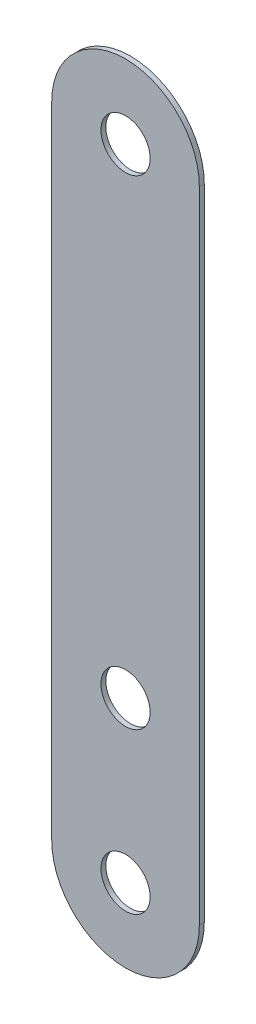
ISO-10303-21;
HEADER;
FILE_DESCRIPTION(('STEP AP214'),'2;1');
FILE_NAME('part.step','',(''),(''),'','','');
FILE_SCHEMA(('AUTOMOTIVE_DESIGN { 1 0 10303 214 1 1 1 1 }'));
ENDSEC;
DATA;
#1=APPLICATION_CONTEXT('core data for automotive mechanical design processes');
#2=APPLICATION_PROTOCOL_DEFINITION('international standard','automotive_design',2000,#1);
#3=PRODUCT_CONTEXT('',#1,'mechanical');
#4=PRODUCT('Part','Part','',(#3));
#5=PRODUCT_RELATED_PRODUCT_CATEGORY('part','',(#4));
#6=PRODUCT_DEFINITION_FORMATION('','',#4);
#7=PRODUCT_DEFINITION_CONTEXT('part definition',#1,'design');
#8=PRODUCT_DEFINITION('design','',#6,#7);
#9=PRODUCT_DEFINITION_SHAPE('','',#8);
#10=(LENGTH_UNIT() NAMED_UNIT(*) SI_UNIT(.MILLI.,.METRE.));
#11=(NAMED_UNIT(*) PLANE_ANGLE_UNIT() SI_UNIT($,.RADIAN.));
#12=(NAMED_UNIT(*) SI_UNIT($,.STERADIAN.) SOLID_ANGLE_UNIT());
#13=UNCERTAINTY_MEASURE_WITH_UNIT(LENGTH_MEASURE(1.E-05),#10,'distance_accuracy_value','');
#14=(GEOMETRIC_REPRESENTATION_CONTEXT(3) GLOBAL_UNCERTAINTY_ASSIGNED_CONTEXT((#13)) GLOBAL_UNIT_ASSIGNED_CONTEXT((#10,
#11,#12)) REPRESENTATION_CONTEXT('',''));
#15=CARTESIAN_POINT('',(0.,0.,0.));
#16=DIRECTION('',(0.,0.,1.));
#17=DIRECTION('',(1.,0.,0.));
#18=AXIS2_PLACEMENT_3D('',#15,#16,#17);
#19=CARTESIAN_POINT('',(15.,0.,1.));
#20=DIRECTION('',(0.,0.,1.));
#21=DIRECTION('',(1.,0.,0.));
#22=AXIS2_PLACEMENT_3D('',#19,#20,#21);
#23=PLANE('',#22);
#24=CARTESIAN_POINT('',(15.,0.,1.));
#25=DIRECTION('',(0.,0.,1.));
#26=DIRECTION('',(1.,0.,0.));
#27=AXIS2_PLACEMENT_3D('',#24,#25,#26);
#28=CIRCLE('',#27,5.);
#29=CARTESIAN_POINT('',(20.,0.,1.));
#30=VERTEX_POINT('',#29);
#31=EDGE_CURVE('E117',#30,#30,#28,.T.);
#32=ORIENTED_EDGE('',*,*,#31,.F.);
#33=EDGE_LOOP('',(#32));
#34=FACE_BOUND('',#33,.T.);
#35=CARTESIAN_POINT('',(15.,0.,1.));
#36=DIRECTION('',(0.,0.,1.));
#37=DIRECTION('',(1.,0.,0.));
#38=AXIS2_PLACEMENT_3D('',#35,#36,#37);
#39=CIRCLE('',#38,15.);
#40=CARTESIAN_POINT('',(0.,0.,1.));
#41=VERTEX_POINT('',#40);
#42=CARTESIAN_POINT('',(30.,0.,1.));
#43=VERTEX_POINT('',#42);
#44=EDGE_CURVE('E87',#41,#43,#39,.T.);
#45=ORIENTED_EDGE('',*,*,#44,.T.);
#46=DIRECTION('',(0.,1.,0.));
#47=VECTOR('',#46,1.);
#48=CARTESIAN_POINT('',(30.,0.,1.));
#49=LINE('',#48,#47);
#50=CARTESIAN_POINT('',(30.,130.,1.));
#51=VERTEX_POINT('',#50);
#52=EDGE_CURVE('E82',#43,#51,#49,.T.);
#53=ORIENTED_EDGE('',*,*,#52,.T.);
#54=CARTESIAN_POINT('',(15.,130.,1.));
#55=DIRECTION('',(0.,0.,1.));
#56=DIRECTION('',(1.,0.,0.));
#57=AXIS2_PLACEMENT_3D('',#54,#55,#56);
#58=CIRCLE('',#57,15.);
#59=CARTESIAN_POINT('',(0.,130.,1.));
#60=VERTEX_POINT('',#59);
#61=EDGE_CURVE('E85',#51,#60,#58,.T.);
#62=ORIENTED_EDGE('',*,*,#61,.T.);
#63=DIRECTION('',(0.,-1.,0.));
#64=VECTOR('',#63,1.);
#65=CARTESIAN_POINT('',(0.,0.,1.));
#66=LINE('',#65,#64);
#67=EDGE_CURVE('E52',#60,#41,#66,.T.);
#68=ORIENTED_EDGE('',*,*,#67,.T.);
#69=EDGE_LOOP('',(#45,#53,#62,#68));
#70=FACE_BOUND('',#69,.T.);
#71=CARTESIAN_POINT('',(15.,130.,1.));
#72=DIRECTION('',(0.,0.,1.));
#73=DIRECTION('',(1.,0.,0.));
#74=AXIS2_PLACEMENT_3D('',#71,#72,#73);
#75=CIRCLE('',#74,5.);
#76=CARTESIAN_POINT('',(20.,130.,1.));
#77=VERTEX_POINT('',#76);
#78=EDGE_CURVE('E102',#77,#77,#75,.T.);
#79=ORIENTED_EDGE('',*,*,#78,.F.);
#80=EDGE_LOOP('',(#79));
#81=FACE_BOUND('',#80,.T.);
#82=CARTESIAN_POINT('',(15.,32.5,1.));
#83=DIRECTION('',(0.,0.,1.));
#84=DIRECTION('',(1.,0.,0.));
#85=AXIS2_PLACEMENT_3D('',#82,#83,#84);
#86=CIRCLE('',#85,5.);
#87=CARTESIAN_POINT('',(20.,32.5,1.));
#88=VERTEX_POINT('',#87);
#89=EDGE_CURVE('E123',#88,#88,#86,.T.);
#90=ORIENTED_EDGE('',*,*,#89,.F.);
#91=EDGE_LOOP('',(#90));
#92=FACE_BOUND('',#91,.T.);
#93=ADVANCED_FACE('F35',(#34,#70,#81,#92),#23,.T.);
#94=CARTESIAN_POINT('',(15.,0.,0.));
#95=DIRECTION('',(0.,0.,1.));
#96=DIRECTION('',(1.,0.,0.));
#97=AXIS2_PLACEMENT_3D('',#94,#95,#96);
#98=PLANE('',#97);
#99=CARTESIAN_POINT('',(15.,0.,0.));
#100=DIRECTION('',(0.,0.,1.));
#101=DIRECTION('',(1.,0.,0.));
#102=AXIS2_PLACEMENT_3D('',#99,#100,#101);
#103=CIRCLE('',#102,15.);
#104=CARTESIAN_POINT('',(0.,0.,0.));
#105=VERTEX_POINT('',#104);
#106=CARTESIAN_POINT('',(30.,0.,0.));
#107=VERTEX_POINT('',#106);
#108=EDGE_CURVE('E99',#105,#107,#103,.T.);
#109=ORIENTED_EDGE('',*,*,#108,.F.);
#110=DIRECTION('',(0.,-1.,0.));
#111=VECTOR('',#110,1.);
#112=CARTESIAN_POINT('',(0.,0.,0.));
#113=LINE('',#112,#111);
#114=CARTESIAN_POINT('',(0.,130.,0.));
#115=VERTEX_POINT('',#114);
#116=EDGE_CURVE('E75',#115,#105,#113,.T.);
#117=ORIENTED_EDGE('',*,*,#116,.F.);
#118=CARTESIAN_POINT('',(15.,130.,0.));
#119=DIRECTION('',(0.,0.,1.));
#120=DIRECTION('',(1.,0.,0.));
#121=AXIS2_PLACEMENT_3D('',#118,#119,#120);
#122=CIRCLE('',#121,15.);
#123=CARTESIAN_POINT('',(30.,130.,0.));
#124=VERTEX_POINT('',#123);
#125=EDGE_CURVE('E69',#124,#115,#122,.T.);
#126=ORIENTED_EDGE('',*,*,#125,.F.);
#127=DIRECTION('',(0.,1.,0.));
#128=VECTOR('',#127,1.);
#129=CARTESIAN_POINT('',(30.,0.,0.));
#130=LINE('',#129,#128);
#131=EDGE_CURVE('E91',#107,#124,#130,.T.);
#132=ORIENTED_EDGE('',*,*,#131,.F.);
#133=EDGE_LOOP('',(#109,#117,#126,#132));
#134=FACE_BOUND('',#133,.T.);
#135=CARTESIAN_POINT('',(15.,130.,0.));
#136=DIRECTION('',(0.,0.,1.));
#137=DIRECTION('',(1.,0.,0.));
#138=AXIS2_PLACEMENT_3D('',#135,#136,#137);
#139=CIRCLE('',#138,5.);
#140=CARTESIAN_POINT('',(20.,130.,0.));
#141=VERTEX_POINT('',#140);
#142=EDGE_CURVE('E114',#141,#141,#139,.T.);
#143=ORIENTED_EDGE('',*,*,#142,.T.);
#144=EDGE_LOOP('',(#143));
#145=FACE_BOUND('',#144,.T.);
#146=CARTESIAN_POINT('',(15.,0.,0.));
#147=DIRECTION('',(0.,0.,1.));
#148=DIRECTION('',(1.,0.,0.));
#149=AXIS2_PLACEMENT_3D('',#146,#147,#148);
#150=CIRCLE('',#149,5.);
#151=CARTESIAN_POINT('',(20.,0.,0.));
#152=VERTEX_POINT('',#151);
#153=EDGE_CURVE('E120',#152,#152,#150,.T.);
#154=ORIENTED_EDGE('',*,*,#153,.T.);
#155=EDGE_LOOP('',(#154));
#156=FACE_BOUND('',#155,.T.);
#157=CARTESIAN_POINT('',(15.,32.5,0.));
#158=DIRECTION('',(0.,0.,1.));
#159=DIRECTION('',(1.,0.,0.));
#160=AXIS2_PLACEMENT_3D('',#157,#158,#159);
#161=CIRCLE('',#160,5.);
#162=CARTESIAN_POINT('',(20.,32.5,0.));
#163=VERTEX_POINT('',#162);
#164=EDGE_CURVE('E126',#163,#163,#161,.T.);
#165=ORIENTED_EDGE('',*,*,#164,.T.);
#166=EDGE_LOOP('',(#165));
#167=FACE_BOUND('',#166,.T.);
#168=ADVANCED_FACE('F110',(#134,#145,#156,#167),#98,.F.);
#169=CARTESIAN_POINT('',(15.,0.,1.));
#170=DIRECTION('',(0.,0.,-1.));
#171=DIRECTION('',(-1.,0.,0.));
#172=AXIS2_PLACEMENT_3D('',#169,#170,#171);
#173=CYLINDRICAL_SURFACE('',#172,15.);
#174=ORIENTED_EDGE('',*,*,#108,.T.);
#175=DIRECTION('',(0.,0.,-1.));
#176=VECTOR('',#175,1.);
#177=CARTESIAN_POINT('',(30.,0.,1.));
#178=LINE('',#177,#176);
#179=EDGE_CURVE('E11',#43,#107,#178,.T.);
#180=ORIENTED_EDGE('',*,*,#179,.F.);
#181=ORIENTED_EDGE('',*,*,#44,.F.);
#182=DIRECTION('',(0.,0.,-1.));
#183=VECTOR('',#182,1.);
#184=CARTESIAN_POINT('',(0.,0.,1.));
#185=LINE('',#184,#183);
#186=EDGE_CURVE('E95',#41,#105,#185,.T.);
#187=ORIENTED_EDGE('',*,*,#186,.T.);
#188=EDGE_LOOP('',(#174,#180,#181,#187));
#189=FACE_BOUND('',#188,.T.);
#190=ADVANCED_FACE('F37',(#189),#173,.T.);
#191=CARTESIAN_POINT('',(30.,0.,1.));
#192=DIRECTION('',(-1.,0.,0.));
#193=DIRECTION('',(0.,-1.,0.));
#194=AXIS2_PLACEMENT_3D('',#191,#192,#193);
#195=PLANE('',#194);
#196=ORIENTED_EDGE('',*,*,#131,.T.);
#197=DIRECTION('',(0.,0.,-1.));
#198=VECTOR('',#197,1.);
#199=CARTESIAN_POINT('',(30.,130.,1.));
#200=LINE('',#199,#198);
#201=EDGE_CURVE('E44',#51,#124,#200,.T.);
#202=ORIENTED_EDGE('',*,*,#201,.F.);
#203=ORIENTED_EDGE('',*,*,#52,.F.);
#204=ORIENTED_EDGE('',*,*,#179,.T.);
#205=EDGE_LOOP('',(#196,#202,#203,#204));
#206=FACE_BOUND('',#205,.T.);
#207=ADVANCED_FACE('F90',(#206),#195,.F.);
#208=CARTESIAN_POINT('',(15.,130.,1.));
#209=DIRECTION('',(0.,0.,-1.));
#210=DIRECTION('',(-1.,0.,0.));
#211=AXIS2_PLACEMENT_3D('',#208,#209,#210);
#212=CYLINDRICAL_SURFACE('',#211,15.);
#213=ORIENTED_EDGE('',*,*,#125,.T.);
#214=DIRECTION('',(0.,0.,-1.));
#215=VECTOR('',#214,1.);
#216=CARTESIAN_POINT('',(0.,130.,1.));
#217=LINE('',#216,#215);
#218=EDGE_CURVE('E92',#60,#115,#217,.T.);
#219=ORIENTED_EDGE('',*,*,#218,.F.);
#220=ORIENTED_EDGE('',*,*,#61,.F.);
#221=ORIENTED_EDGE('',*,*,#201,.T.);
#222=EDGE_LOOP('',(#213,#219,#220,#221));
#223=FACE_BOUND('',#222,.T.);
#224=ADVANCED_FACE('F93',(#223),#212,.T.);
#225=CARTESIAN_POINT('',(0.,0.,1.));
#226=DIRECTION('',(1.,0.,0.));
#227=DIRECTION('',(0.,0.,-1.));
#228=AXIS2_PLACEMENT_3D('',#225,#226,#227);
#229=PLANE('',#228);
#230=ORIENTED_EDGE('',*,*,#116,.T.);
#231=ORIENTED_EDGE('',*,*,#186,.F.);
#232=ORIENTED_EDGE('',*,*,#67,.F.);
#233=ORIENTED_EDGE('',*,*,#218,.T.);
#234=EDGE_LOOP('',(#230,#231,#232,#233));
#235=FACE_BOUND('',#234,.T.);
#236=ADVANCED_FACE('F107',(#235),#229,.F.);
#237=CARTESIAN_POINT('',(15.,130.,1.));
#238=DIRECTION('',(0.,0.,-1.));
#239=DIRECTION('',(-1.,0.,0.));
#240=AXIS2_PLACEMENT_3D('',#237,#238,#239);
#241=CYLINDRICAL_SURFACE('',#240,5.);
#242=ORIENTED_EDGE('',*,*,#78,.T.);
#243=EDGE_LOOP('',(#242));
#244=FACE_BOUND('',#243,.T.);
#245=ORIENTED_EDGE('',*,*,#142,.F.);
#246=EDGE_LOOP('',(#245));
#247=FACE_BOUND('',#246,.T.);
#248=ADVANCED_FACE('F144',(#244,#247),#241,.F.);
#249=CARTESIAN_POINT('',(15.,0.,1.));
#250=DIRECTION('',(0.,0.,-1.));
#251=DIRECTION('',(-1.,0.,0.));
#252=AXIS2_PLACEMENT_3D('',#249,#250,#251);
#253=CYLINDRICAL_SURFACE('',#252,5.);
#254=ORIENTED_EDGE('',*,*,#31,.T.);
#255=EDGE_LOOP('',(#254));
#256=FACE_BOUND('',#255,.T.);
#257=ORIENTED_EDGE('',*,*,#153,.F.);
#258=EDGE_LOOP('',(#257));
#259=FACE_BOUND('',#258,.T.);
#260=ADVANCED_FACE('F190',(#256,#259),#253,.F.);
#261=CARTESIAN_POINT('',(15.,32.5,1.));
#262=DIRECTION('',(0.,0.,-1.));
#263=DIRECTION('',(-1.,0.,0.));
#264=AXIS2_PLACEMENT_3D('',#261,#262,#263);
#265=CYLINDRICAL_SURFACE('',#264,5.);
#266=ORIENTED_EDGE('',*,*,#89,.T.);
#267=EDGE_LOOP('',(#266));
#268=FACE_BOUND('',#267,.T.);
#269=ORIENTED_EDGE('',*,*,#164,.F.);
#270=EDGE_LOOP('',(#269));
#271=FACE_BOUND('',#270,.T.);
#272=ADVANCED_FACE('F132',(#268,#271),#265,.F.);
#273=CLOSED_SHELL('',(#93,#168,#190,#207,#224,#236,#248,#260,#272));
#274=MANIFOLD_SOLID_BREP('B2',#273);
#275=ADVANCED_BREP_SHAPE_REPRESENTATION('',(#18,#274),#14);
#276=SHAPE_DEFINITION_REPRESENTATION(#9,#275);
ENDSEC;
END-ISO-10303-21;
